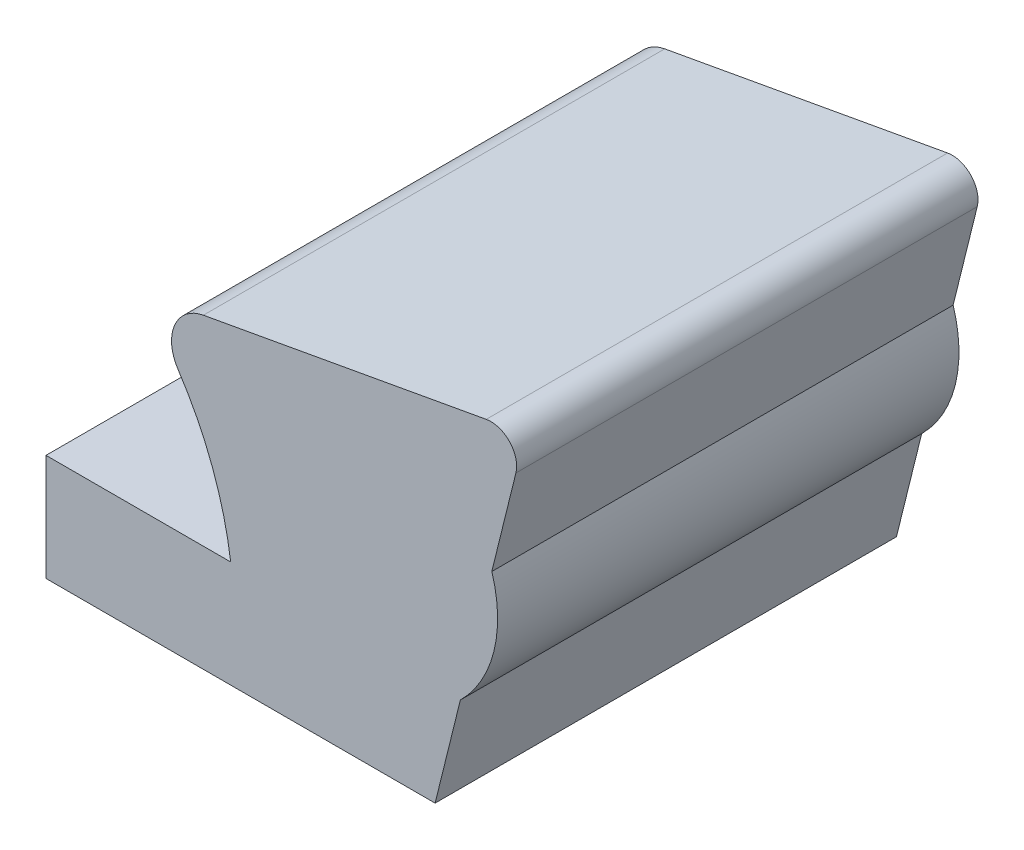
ISO-10303-21;
HEADER;
FILE_DESCRIPTION(('STEP AP214'),'2;1');
FILE_NAME('part.step','',(''),(''),'','','');
FILE_SCHEMA(('AUTOMOTIVE_DESIGN { 1 0 10303 214 1 1 1 1 }'));
ENDSEC;
DATA;
#1=APPLICATION_CONTEXT('core data for automotive mechanical design processes');
#2=APPLICATION_PROTOCOL_DEFINITION('international standard','automotive_design',2000,#1);
#3=PRODUCT_CONTEXT('',#1,'mechanical');
#4=PRODUCT('Part','Part','',(#3));
#5=PRODUCT_RELATED_PRODUCT_CATEGORY('part','',(#4));
#6=PRODUCT_DEFINITION_FORMATION('','',#4);
#7=PRODUCT_DEFINITION_CONTEXT('part definition',#1,'design');
#8=PRODUCT_DEFINITION('design','',#6,#7);
#9=PRODUCT_DEFINITION_SHAPE('','',#8);
#10=(LENGTH_UNIT() NAMED_UNIT(*) SI_UNIT(.MILLI.,.METRE.));
#11=(NAMED_UNIT(*) PLANE_ANGLE_UNIT() SI_UNIT($,.RADIAN.));
#12=(NAMED_UNIT(*) SI_UNIT($,.STERADIAN.) SOLID_ANGLE_UNIT());
#13=UNCERTAINTY_MEASURE_WITH_UNIT(LENGTH_MEASURE(1.E-05),#10,'distance_accuracy_value','');
#14=(GEOMETRIC_REPRESENTATION_CONTEXT(3) GLOBAL_UNCERTAINTY_ASSIGNED_CONTEXT((#13)) GLOBAL_UNIT_ASSIGNED_CONTEXT((#10,
#11,#12)) REPRESENTATION_CONTEXT('',''));
#15=CARTESIAN_POINT('',(0.,0.,0.));
#16=DIRECTION('',(0.,0.,1.));
#17=DIRECTION('',(1.,0.,0.));
#18=AXIS2_PLACEMENT_3D('',#15,#16,#17);
#19=CARTESIAN_POINT('',(114.130876530088,-28.2566531285422,50.));
#20=DIRECTION('',(-0.970692445387377,0.240325147389686,0.));
#21=DIRECTION('',(-0.240325147389686,-0.970692445387377,0.));
#22=AXIS2_PLACEMENT_3D('',#19,#20,#21);
#23=PLANE('',#22);
#24=DIRECTION('',(0.240325147389686,0.970692445387377,0.));
#25=VECTOR('',#24,1.);
#26=CARTESIAN_POINT('',(114.130876530088,-28.2566531285422,-50.));
#27=LINE('',#26,#25);
#28=CARTESIAN_POINT('',(136.603924056532,62.5137789119227,-50.));
#29=VERTEX_POINT('',#28);
#30=CARTESIAN_POINT('',(142.075022587558,84.6119824071451,-50.));
#31=VERTEX_POINT('',#30);
#32=EDGE_CURVE('E159',#29,#31,#27,.T.);
#33=ORIENTED_EDGE('',*,*,#32,.T.);
#34=DIRECTION('',(0.,0.,-1.));
#35=VECTOR('',#34,1.);
#36=CARTESIAN_POINT('',(142.075022587558,84.6119824071451,50.));
#37=LINE('',#36,#35);
#38=CARTESIAN_POINT('',(142.075022587558,84.6119824071451,50.));
#39=VERTEX_POINT('',#38);
#40=EDGE_CURVE('E153',#39,#31,#37,.T.);
#41=ORIENTED_EDGE('',*,*,#40,.F.);
#42=DIRECTION('',(0.240325147389686,0.970692445387377,0.));
#43=VECTOR('',#42,1.);
#44=CARTESIAN_POINT('',(114.130876530088,-28.2566531285422,50.));
#45=LINE('',#44,#43);
#46=CARTESIAN_POINT('',(136.603924056532,62.5137789119227,50.));
#47=VERTEX_POINT('',#46);
#48=EDGE_CURVE('E135',#47,#39,#45,.T.);
#49=ORIENTED_EDGE('',*,*,#48,.F.);
#50=DIRECTION('',(0.,0.,-1.));
#51=VECTOR('',#50,1.);
#52=CARTESIAN_POINT('',(136.603924056532,62.5137789119227,50.));
#53=LINE('',#52,#51);
#54=EDGE_CURVE('E150',#47,#29,#53,.T.);
#55=ORIENTED_EDGE('',*,*,#54,.T.);
#56=EDGE_LOOP('',(#33,#41,#49,#55));
#57=FACE_BOUND('',#56,.T.);
#58=ADVANCED_FACE('F37',(#57),#23,.F.);
#59=CARTESIAN_POINT('',(122.968495612539,103.949999999997,50.));
#60=DIRECTION('',(0.,0.,-1.));
#61=DIRECTION('',(-1.,0.,0.));
#62=AXIS2_PLACEMENT_3D('',#59,#60,#61);
#63=CYLINDRICAL_SURFACE('',#62,27.1848909776837);
#64=CARTESIAN_POINT('',(122.968495612539,103.949999999997,-50.));
#65=DIRECTION('',(0.,0.,1.));
#66=DIRECTION('',(1.,0.,0.));
#67=AXIS2_PLACEMENT_3D('',#64,#65,#66);
#68=CIRCLE('',#67,27.1848909776837);
#69=CARTESIAN_POINT('',(148.890397998908,112.139827479261,-50.));
#70=VERTEX_POINT('',#69);
#71=EDGE_CURVE('E133',#31,#70,#68,.T.);
#72=ORIENTED_EDGE('',*,*,#71,.T.);
#73=DIRECTION('',(0.,0.,-1.));
#74=VECTOR('',#73,1.);
#75=CARTESIAN_POINT('',(148.890397998908,112.139827479261,50.));
#76=LINE('',#75,#74);
#77=CARTESIAN_POINT('',(148.890397998908,112.139827479261,50.));
#78=VERTEX_POINT('',#77);
#79=EDGE_CURVE('E156',#78,#70,#76,.T.);
#80=ORIENTED_EDGE('',*,*,#79,.F.);
#81=CARTESIAN_POINT('',(122.968495612539,103.949999999997,50.));
#82=DIRECTION('',(0.,0.,1.));
#83=DIRECTION('',(1.,0.,0.));
#84=AXIS2_PLACEMENT_3D('',#81,#82,#83);
#85=CIRCLE('',#84,27.1848909776837);
#86=EDGE_CURVE('E129',#39,#78,#85,.T.);
#87=ORIENTED_EDGE('',*,*,#86,.F.);
#88=ORIENTED_EDGE('',*,*,#40,.T.);
#89=EDGE_LOOP('',(#72,#80,#87,#88));
#90=FACE_BOUND('',#89,.T.);
#91=ADVANCED_FACE('F216',(#90),#63,.T.);
#92=CARTESIAN_POINT('',(154.115877694168,133.245956899374,-50.));
#93=VERTEX_POINT('',#92);
#94=EDGE_CURVE('E138',#70,#93,#27,.T.);
#95=ORIENTED_EDGE('',*,*,#94,.T.);
#96=DIRECTION('',(0.,0.,-1.));
#97=VECTOR('',#96,1.);
#98=CARTESIAN_POINT('',(154.115877694168,133.245956899374,50.));
#99=LINE('',#98,#97);
#100=CARTESIAN_POINT('',(154.115877694168,133.245956899374,50.));
#101=VERTEX_POINT('',#100);
#102=EDGE_CURVE('E45',#101,#93,#99,.T.);
#103=ORIENTED_EDGE('',*,*,#102,.F.);
#104=EDGE_CURVE('E123',#78,#101,#45,.T.);
#105=ORIENTED_EDGE('',*,*,#104,.F.);
#106=ORIENTED_EDGE('',*,*,#79,.T.);
#107=EDGE_LOOP('',(#95,#103,#105,#106));
#108=FACE_BOUND('',#107,.T.);
#109=ADVANCED_FACE('F136',(#108),#23,.F.);
#110=CARTESIAN_POINT('',(148.68,134.591777724756,50.));
#111=DIRECTION('',(0.,0.,-1.));
#112=DIRECTION('',(-1.,0.,0.));
#113=AXIS2_PLACEMENT_3D('',#110,#111,#112);
#114=CYLINDRICAL_SURFACE('',#113,5.59999999999859);
#115=CARTESIAN_POINT('',(148.68,134.591777724756,-50.));
#116=DIRECTION('',(0.,0.,1.));
#117=DIRECTION('',(1.,0.,0.));
#118=AXIS2_PLACEMENT_3D('',#115,#116,#117);
#119=CIRCLE('',#118,5.59999999999859);
#120=CARTESIAN_POINT('',(147.681959543101,140.102123924985,-50.));
#121=VERTEX_POINT('',#120);
#122=EDGE_CURVE('E175',#93,#121,#119,.T.);
#123=ORIENTED_EDGE('',*,*,#122,.T.);
#124=DIRECTION('',(0.,0.,-1.));
#125=VECTOR('',#124,1.);
#126=CARTESIAN_POINT('',(147.681959543101,140.102123924985,50.));
#127=LINE('',#126,#125);
#128=CARTESIAN_POINT('',(147.681959543101,140.102123924985,50.));
#129=VERTEX_POINT('',#128);
#130=EDGE_CURVE('E119',#129,#121,#127,.T.);
#131=ORIENTED_EDGE('',*,*,#130,.F.);
#132=CARTESIAN_POINT('',(148.68,134.591777724756,50.));
#133=DIRECTION('',(0.,0.,1.));
#134=DIRECTION('',(1.,0.,0.));
#135=AXIS2_PLACEMENT_3D('',#132,#133,#134);
#136=CIRCLE('',#135,5.59999999999859);
#137=EDGE_CURVE('E114',#101,#129,#136,.T.);
#138=ORIENTED_EDGE('',*,*,#137,.F.);
#139=ORIENTED_EDGE('',*,*,#102,.T.);
#140=EDGE_LOOP('',(#123,#131,#138,#139));
#141=FACE_BOUND('',#140,.T.);
#142=ADVANCED_FACE('F39',(#141),#114,.T.);
#143=CARTESIAN_POINT('',(-19.8786565273607,109.753345872808,50.));
#144=DIRECTION('',(0.178221510160748,-0.983990392898235,0.));
#145=DIRECTION('',(0.983990392898235,0.178221510160748,0.));
#146=AXIS2_PLACEMENT_3D('',#143,#144,#145);
#147=PLANE('',#146);
#148=DIRECTION('',(-0.983990392898235,-0.178221510160748,0.));
#149=VECTOR('',#148,1.);
#150=CARTESIAN_POINT('',(-19.8786565273607,109.753345872808,-50.));
#151=LINE('',#150,#149);
#152=CARTESIAN_POINT('',(86.3738372058977,128.997923897306,-50.));
#153=VERTEX_POINT('',#152);
#154=EDGE_CURVE('E173',#121,#153,#151,.T.);
#155=ORIENTED_EDGE('',*,*,#154,.T.);
#156=DIRECTION('',(0.,0.,-1.));
#157=VECTOR('',#156,1.);
#158=CARTESIAN_POINT('',(86.3738372058977,128.997923897306,50.));
#159=LINE('',#158,#157);
#160=CARTESIAN_POINT('',(86.3738372058977,128.997923897306,50.));
#161=VERTEX_POINT('',#160);
#162=EDGE_CURVE('E139',#161,#153,#159,.T.);
#163=ORIENTED_EDGE('',*,*,#162,.F.);
#164=DIRECTION('',(-0.983990392898235,-0.178221510160748,0.));
#165=VECTOR('',#164,1.);
#166=CARTESIAN_POINT('',(-19.8786565273607,109.753345872808,50.));
#167=LINE('',#166,#165);
#168=EDGE_CURVE('E122',#129,#161,#167,.T.);
#169=ORIENTED_EDGE('',*,*,#168,.F.);
#170=ORIENTED_EDGE('',*,*,#130,.T.);
#171=EDGE_LOOP('',(#155,#163,#169,#170));
#172=FACE_BOUND('',#171,.T.);
#173=ADVANCED_FACE('F195',(#172),#147,.F.);
#174=CARTESIAN_POINT('',(87.8708978912478,120.732404596962,50.));
#175=DIRECTION('',(0.,0.,-1.));
#176=DIRECTION('',(-1.,0.,0.));
#177=AXIS2_PLACEMENT_3D('',#174,#175,#176);
#178=CYLINDRICAL_SURFACE('',#177,8.39999999999893);
#179=CARTESIAN_POINT('',(87.8708978912478,120.732404596962,-50.));
#180=DIRECTION('',(0.,0.,1.));
#181=DIRECTION('',(1.,0.,0.));
#182=AXIS2_PLACEMENT_3D('',#179,#180,#181);
#183=CIRCLE('',#182,8.39999999999893);
#184=CARTESIAN_POINT('',(80.863683371165,116.100024574822,-50.));
#185=VERTEX_POINT('',#184);
#186=EDGE_CURVE('E170',#153,#185,#183,.T.);
#187=ORIENTED_EDGE('',*,*,#186,.T.);
#188=DIRECTION('',(0.,0.,-1.));
#189=VECTOR('',#188,1.);
#190=CARTESIAN_POINT('',(80.863683371165,116.100024574822,50.));
#191=LINE('',#190,#189);
#192=CARTESIAN_POINT('',(80.863683371165,116.100024574822,50.));
#193=VERTEX_POINT('',#192);
#194=EDGE_CURVE('E144',#193,#185,#191,.T.);
#195=ORIENTED_EDGE('',*,*,#194,.F.);
#196=CARTESIAN_POINT('',(87.8708978912478,120.732404596962,50.));
#197=DIRECTION('',(0.,0.,1.));
#198=DIRECTION('',(1.,0.,0.));
#199=AXIS2_PLACEMENT_3D('',#196,#197,#198);
#200=CIRCLE('',#199,8.39999999999893);
#201=EDGE_CURVE('E188',#161,#193,#200,.T.);
#202=ORIENTED_EDGE('',*,*,#201,.F.);
#203=ORIENTED_EDGE('',*,*,#162,.T.);
#204=EDGE_LOOP('',(#187,#195,#202,#203));
#205=FACE_BOUND('',#204,.T.);
#206=ADVANCED_FACE('F199',(#205),#178,.T.);
#207=CARTESIAN_POINT('',(20.1344908637742,75.9527310496031,50.));
#208=DIRECTION('',(0.,0.,-1.));
#209=DIRECTION('',(-1.,0.,0.));
#210=AXIS2_PLACEMENT_3D('',#207,#208,#209);
#211=CYLINDRICAL_SURFACE('',#210,72.7999999999985);
#212=CARTESIAN_POINT('',(20.1344908637742,75.9527310496031,-50.));
#213=DIRECTION('',(0.,0.,1.));
#214=DIRECTION('',(1.,0.,0.));
#215=AXIS2_PLACEMENT_3D('',#212,#213,#214);
#216=CIRCLE('',#215,72.7999999999985);
#217=CARTESIAN_POINT('',(92.2882238791872,85.6315125814018,-50.));
#218=VERTEX_POINT('',#217);
#219=EDGE_CURVE('E167',#218,#185,#216,.T.);
#220=ORIENTED_EDGE('',*,*,#219,.F.);
#221=DIRECTION('',(0.,0.,-1.));
#222=VECTOR('',#221,1.);
#223=CARTESIAN_POINT('',(92.2882238791872,85.6315125814018,50.));
#224=LINE('',#223,#222);
#225=CARTESIAN_POINT('',(92.2882238791872,85.6315125814018,50.));
#226=VERTEX_POINT('',#225);
#227=EDGE_CURVE('E146',#226,#218,#224,.T.);
#228=ORIENTED_EDGE('',*,*,#227,.F.);
#229=CARTESIAN_POINT('',(20.1344908637742,75.9527310496031,50.));
#230=DIRECTION('',(0.,0.,1.));
#231=DIRECTION('',(1.,0.,0.));
#232=AXIS2_PLACEMENT_3D('',#229,#230,#231);
#233=CIRCLE('',#232,72.7999999999985);
#234=EDGE_CURVE('E185',#226,#193,#233,.T.);
#235=ORIENTED_EDGE('',*,*,#234,.T.);
#236=ORIENTED_EDGE('',*,*,#194,.T.);
#237=EDGE_LOOP('',(#220,#228,#235,#236));
#238=FACE_BOUND('',#237,.T.);
#239=ADVANCED_FACE('F202',(#238),#211,.F.);
#240=CARTESIAN_POINT('',(0.,85.6315125814018,50.));
#241=DIRECTION('',(0.,1.,0.));
#242=DIRECTION('',(0.,0.,1.));
#243=AXIS2_PLACEMENT_3D('',#240,#241,#242);
#244=PLANE('',#243);
#245=DIRECTION('',(1.,0.,0.));
#246=VECTOR('',#245,1.);
#247=CARTESIAN_POINT('',(0.,85.6315125814018,-50.));
#248=LINE('',#247,#246);
#249=CARTESIAN_POINT('',(52.259104563702,85.6315125814018,-50.));
#250=VERTEX_POINT('',#249);
#251=EDGE_CURVE('E164',#250,#218,#248,.T.);
#252=ORIENTED_EDGE('',*,*,#251,.F.);
#253=DIRECTION('',(0.,0.,-1.));
#254=VECTOR('',#253,1.);
#255=CARTESIAN_POINT('',(52.259104563702,85.6315125814018,50.));
#256=LINE('',#255,#254);
#257=CARTESIAN_POINT('',(52.259104563702,85.6315125814018,50.));
#258=VERTEX_POINT('',#257);
#259=EDGE_CURVE('E148',#258,#250,#256,.T.);
#260=ORIENTED_EDGE('',*,*,#259,.F.);
#261=DIRECTION('',(1.,0.,0.));
#262=VECTOR('',#261,1.);
#263=CARTESIAN_POINT('',(0.,85.6315125814018,50.));
#264=LINE('',#263,#262);
#265=EDGE_CURVE('E182',#258,#226,#264,.T.);
#266=ORIENTED_EDGE('',*,*,#265,.T.);
#267=ORIENTED_EDGE('',*,*,#227,.T.);
#268=EDGE_LOOP('',(#252,#260,#266,#267));
#269=FACE_BOUND('',#268,.T.);
#270=ADVANCED_FACE('F206',(#269),#244,.T.);
#271=CARTESIAN_POINT('',(52.259104563702,0.,50.));
#272=DIRECTION('',(1.,0.,0.));
#273=DIRECTION('',(0.,1.,0.));
#274=AXIS2_PLACEMENT_3D('',#271,#272,#273);
#275=PLANE('',#274);
#276=DIRECTION('',(0.,-1.,0.));
#277=VECTOR('',#276,1.);
#278=CARTESIAN_POINT('',(52.259104563702,0.,-50.));
#279=LINE('',#278,#277);
#280=CARTESIAN_POINT('',(52.259104563702,62.5137789119227,-50.));
#281=VERTEX_POINT('',#280);
#282=EDGE_CURVE('E161',#250,#281,#279,.T.);
#283=ORIENTED_EDGE('',*,*,#282,.T.);
#284=DIRECTION('',(0.,0.,1.));
#285=VECTOR('',#284,1.);
#286=CARTESIAN_POINT('',(52.259104563702,62.5137789119227,50.));
#287=LINE('',#286,#285);
#288=CARTESIAN_POINT('',(52.259104563702,62.5137789119227,50.));
#289=VERTEX_POINT('',#288);
#290=EDGE_CURVE('E11',#281,#289,#287,.T.);
#291=ORIENTED_EDGE('',*,*,#290,.T.);
#292=DIRECTION('',(0.,-1.,0.));
#293=VECTOR('',#292,1.);
#294=CARTESIAN_POINT('',(52.259104563702,0.,50.));
#295=LINE('',#294,#293);
#296=EDGE_CURVE('E180',#258,#289,#295,.T.);
#297=ORIENTED_EDGE('',*,*,#296,.F.);
#298=ORIENTED_EDGE('',*,*,#259,.T.);
#299=EDGE_LOOP('',(#283,#291,#297,#298));
#300=FACE_BOUND('',#299,.T.);
#301=ADVANCED_FACE('F209',(#300),#275,.F.);
#302=CARTESIAN_POINT('',(0.,62.5137789119228,50.));
#303=DIRECTION('',(0.,1.,0.));
#304=DIRECTION('',(-1.,0.,0.));
#305=AXIS2_PLACEMENT_3D('',#302,#303,#304);
#306=PLANE('',#305);
#307=DIRECTION('',(1.,0.,0.));
#308=VECTOR('',#307,1.);
#309=CARTESIAN_POINT('',(0.,62.5137789119228,-50.));
#310=LINE('',#309,#308);
#311=EDGE_CURVE('E59',#281,#29,#310,.T.);
#312=ORIENTED_EDGE('',*,*,#311,.T.);
#313=ORIENTED_EDGE('',*,*,#54,.F.);
#314=DIRECTION('',(1.,0.,0.));
#315=VECTOR('',#314,1.);
#316=CARTESIAN_POINT('',(0.,62.5137789119228,50.));
#317=LINE('',#316,#315);
#318=EDGE_CURVE('E52',#289,#47,#317,.T.);
#319=ORIENTED_EDGE('',*,*,#318,.F.);
#320=ORIENTED_EDGE('',*,*,#290,.F.);
#321=EDGE_LOOP('',(#312,#313,#319,#320));
#322=FACE_BOUND('',#321,.T.);
#323=ADVANCED_FACE('F212',(#322),#306,.F.);
#324=CARTESIAN_POINT('',(0.,0.,-50.));
#325=DIRECTION('',(0.,0.,1.));
#326=DIRECTION('',(1.,0.,0.));
#327=AXIS2_PLACEMENT_3D('',#324,#325,#326);
#328=PLANE('',#327);
#329=ORIENTED_EDGE('',*,*,#311,.F.);
#330=ORIENTED_EDGE('',*,*,#282,.F.);
#331=ORIENTED_EDGE('',*,*,#251,.T.);
#332=ORIENTED_EDGE('',*,*,#219,.T.);
#333=ORIENTED_EDGE('',*,*,#186,.F.);
#334=ORIENTED_EDGE('',*,*,#154,.F.);
#335=ORIENTED_EDGE('',*,*,#122,.F.);
#336=ORIENTED_EDGE('',*,*,#94,.F.);
#337=ORIENTED_EDGE('',*,*,#71,.F.);
#338=ORIENTED_EDGE('',*,*,#32,.F.);
#339=EDGE_LOOP('',(#329,#330,#331,#332,#333,#334,#335,#336,#337,#338));
#340=FACE_BOUND('',#339,.T.);
#341=ADVANCED_FACE('F217',(#340),#328,.F.);
#342=CARTESIAN_POINT('',(0.,0.,50.));
#343=DIRECTION('',(0.,0.,1.));
#344=DIRECTION('',(1.,0.,0.));
#345=AXIS2_PLACEMENT_3D('',#342,#343,#344);
#346=PLANE('',#345);
#347=ORIENTED_EDGE('',*,*,#296,.T.);
#348=ORIENTED_EDGE('',*,*,#318,.T.);
#349=ORIENTED_EDGE('',*,*,#48,.T.);
#350=ORIENTED_EDGE('',*,*,#86,.T.);
#351=ORIENTED_EDGE('',*,*,#104,.T.);
#352=ORIENTED_EDGE('',*,*,#137,.T.);
#353=ORIENTED_EDGE('',*,*,#168,.T.);
#354=ORIENTED_EDGE('',*,*,#201,.T.);
#355=ORIENTED_EDGE('',*,*,#234,.F.);
#356=ORIENTED_EDGE('',*,*,#265,.F.);
#357=EDGE_LOOP('',(#347,#348,#349,#350,#351,#352,#353,#354,#355,#356));
#358=FACE_BOUND('',#357,.T.);
#359=ADVANCED_FACE('F127',(#358),#346,.T.);
#360=CLOSED_SHELL('',(#58,#91,#109,#142,#173,#206,#239,#270,#301,#323,#341,#359));
#361=MANIFOLD_SOLID_BREP('B2',#360);
#362=ADVANCED_BREP_SHAPE_REPRESENTATION('',(#18,#361),#14);
#363=SHAPE_DEFINITION_REPRESENTATION(#9,#362);
ENDSEC;
END-ISO-10303-21;
